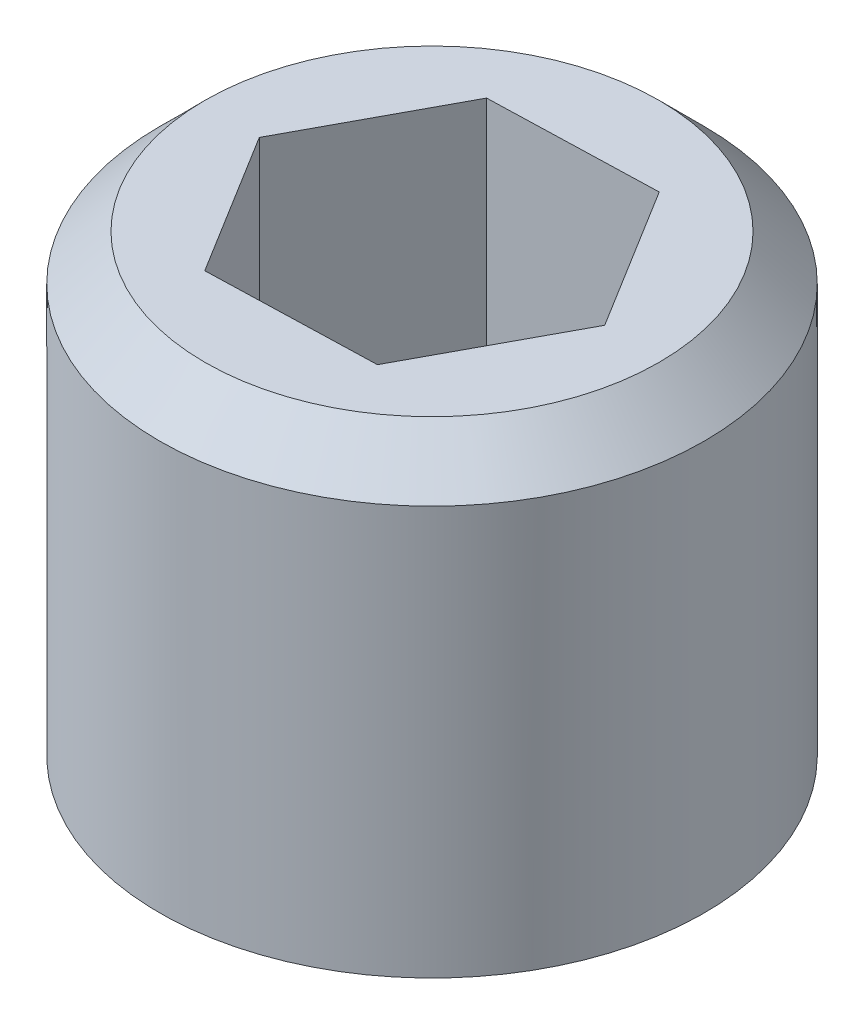
ISO-10303-21;
HEADER;
FILE_DESCRIPTION(('STEP AP214'),'2;1');
FILE_NAME('part.step','',(''),(''),'','','');
FILE_SCHEMA(('AUTOMOTIVE_DESIGN { 1 0 10303 214 1 1 1 1 }'));
ENDSEC;
DATA;
#1=APPLICATION_CONTEXT('core data for automotive mechanical design processes');
#2=APPLICATION_PROTOCOL_DEFINITION('international standard','automotive_design',2000,#1);
#3=PRODUCT_CONTEXT('',#1,'mechanical');
#4=PRODUCT('Part','Part','',(#3));
#5=PRODUCT_RELATED_PRODUCT_CATEGORY('part','',(#4));
#6=PRODUCT_DEFINITION_FORMATION('','',#4);
#7=PRODUCT_DEFINITION_CONTEXT('part definition',#1,'design');
#8=PRODUCT_DEFINITION('design','',#6,#7);
#9=PRODUCT_DEFINITION_SHAPE('','',#8);
#10=(LENGTH_UNIT() NAMED_UNIT(*) SI_UNIT(.MILLI.,.METRE.));
#11=(NAMED_UNIT(*) PLANE_ANGLE_UNIT() SI_UNIT($,.RADIAN.));
#12=(NAMED_UNIT(*) SI_UNIT($,.STERADIAN.) SOLID_ANGLE_UNIT());
#13=UNCERTAINTY_MEASURE_WITH_UNIT(LENGTH_MEASURE(1.E-05),#10,'distance_accuracy_value','');
#14=(GEOMETRIC_REPRESENTATION_CONTEXT(3) GLOBAL_UNCERTAINTY_ASSIGNED_CONTEXT((#13)) GLOBAL_UNIT_ASSIGNED_CONTEXT((#10,
#11,#12)) REPRESENTATION_CONTEXT('',''));
#15=CARTESIAN_POINT('',(0.,0.,0.));
#16=DIRECTION('',(0.,0.,1.));
#17=DIRECTION('',(1.,0.,0.));
#18=AXIS2_PLACEMENT_3D('',#15,#16,#17);
#19=CARTESIAN_POINT('',(-0.125,3.5,0.));
#20=DIRECTION('',(0.,1.,0.));
#21=DIRECTION('',(0.,0.,-1.));
#22=AXIS2_PLACEMENT_3D('',#19,#20,#21);
#23=PLANE('',#22);
#24=DIRECTION('',(0.473942369787866,0.,-0.880555864281115));
#25=VECTOR('',#24,1.);
#26=CARTESIAN_POINT('',(4.28554008760297,3.5,0.785865228053737));
#27=LINE('',#26,#25);
#28=CARTESIAN_POINT('',(4.28554008760297,3.5,0.785865228053737));
#29=VERTEX_POINT('',#28);
#30=CARTESIAN_POINT('',(4.72334929524681,3.5,-0.0275574363929924));
#31=VERTEX_POINT('',#30);
#32=EDGE_CURVE('E117',#29,#31,#27,.T.);
#33=ORIENTED_EDGE('',*,*,#32,.T.);
#34=DIRECTION('',(-0.525612563024875,0.,-0.850724064306648));
#35=VECTOR('',#34,1.);
#36=CARTESIAN_POINT('',(4.72334929524681,3.5,-0.0275574363929924));
#37=LINE('',#36,#35);
#38=CARTESIAN_POINT('',(4.23780920764383,3.5,-0.81342266444665));
#39=VERTEX_POINT('',#38);
#40=EDGE_CURVE('E115',#31,#39,#37,.T.);
#41=ORIENTED_EDGE('',*,*,#40,.T.);
#42=DIRECTION('',(-0.999554932812741,0.,0.0298317999744676));
#43=VECTOR('',#42,1.);
#44=CARTESIAN_POINT('',(4.23780920764383,3.5,-0.81342266444665));
#45=LINE('',#44,#43);
#46=CARTESIAN_POINT('',(3.31445991239702,3.5,-0.785865228053578));
#47=VERTEX_POINT('',#46);
#48=EDGE_CURVE('E102',#39,#47,#45,.T.);
#49=ORIENTED_EDGE('',*,*,#48,.T.);
#50=DIRECTION('',(-0.473942369787866,0.,0.880555864281115));
#51=VECTOR('',#50,1.);
#52=CARTESIAN_POINT('',(3.31445991239702,3.5,-0.785865228053578));
#53=LINE('',#52,#51);
#54=CARTESIAN_POINT('',(2.87665070475319,3.5,0.0275574363931507));
#55=VERTEX_POINT('',#54);
#56=EDGE_CURVE('E158',#47,#55,#53,.T.);
#57=ORIENTED_EDGE('',*,*,#56,.T.);
#58=DIRECTION('',(0.525612563024875,0.,0.850724064306648));
#59=VECTOR('',#58,1.);
#60=CARTESIAN_POINT('',(2.87665070475319,3.5,0.0275574363931507));
#61=LINE('',#60,#59);
#62=CARTESIAN_POINT('',(3.36219079235617,3.5,0.813422664446808));
#63=VERTEX_POINT('',#62);
#64=EDGE_CURVE('E20',#55,#63,#61,.T.);
#65=ORIENTED_EDGE('',*,*,#64,.T.);
#66=DIRECTION('',(0.999554932812741,0.,-0.0298317999744676));
#67=VECTOR('',#66,1.);
#68=CARTESIAN_POINT('',(3.36219079235617,3.5,0.813422664446808));
#69=LINE('',#68,#67);
#70=EDGE_CURVE('E11',#63,#29,#69,.T.);
#71=ORIENTED_EDGE('',*,*,#70,.T.);
#72=EDGE_LOOP('',(#33,#41,#49,#57,#65,#71));
#73=FACE_BOUND('',#72,.T.);
#74=ADVANCED_FACE('F17',(#73),#23,.T.);
#75=CARTESIAN_POINT('',(3.36219079235617,7.00128218155395,0.813422664446808));
#76=DIRECTION('',(-0.0298317999744677,0.,-0.999554932812741));
#77=DIRECTION('',(-0.999554932812741,0.,0.0298317999744677));
#78=AXIS2_PLACEMENT_3D('',#75,#76,#77);
#79=PLANE('',#78);
#80=DIRECTION('',(0.999554932812741,0.,-0.0298317999744676));
#81=VECTOR('',#80,1.);
#82=CARTESIAN_POINT('',(3.36219079235617,5.,0.813422664446808));
#83=LINE('',#82,#81);
#84=CARTESIAN_POINT('',(3.36219079235617,5.,0.813422664446809));
#85=VERTEX_POINT('',#84);
#86=CARTESIAN_POINT('',(4.28554008760297,5.,0.785865228053737));
#87=VERTEX_POINT('',#86);
#88=EDGE_CURVE('E176',#85,#87,#83,.T.);
#89=ORIENTED_EDGE('',*,*,#88,.T.);
#90=DIRECTION('',(0.,-1.,0.));
#91=VECTOR('',#90,1.);
#92=CARTESIAN_POINT('',(4.28554008760297,6.5,0.785865228053737));
#93=LINE('',#92,#91);
#94=EDGE_CURVE('E127',#87,#29,#93,.T.);
#95=ORIENTED_EDGE('',*,*,#94,.T.);
#96=ORIENTED_EDGE('',*,*,#70,.F.);
#97=DIRECTION('',(0.,-1.,0.));
#98=VECTOR('',#97,1.);
#99=CARTESIAN_POINT('',(3.36219079235617,6.5,0.813422664446808));
#100=LINE('',#99,#98);
#101=EDGE_CURVE('E160',#85,#63,#100,.T.);
#102=ORIENTED_EDGE('',*,*,#101,.F.);
#103=EDGE_LOOP('',(#89,#95,#96,#102));
#104=FACE_BOUND('',#103,.T.);
#105=ADVANCED_FACE('F228',(#104),#79,.T.);
#106=CARTESIAN_POINT('',(2.87665070475319,7.00128218155395,0.0275574363931507));
#107=DIRECTION('',(0.850724064306648,0.,-0.525612563024875));
#108=DIRECTION('',(0.,-1.,0.));
#109=AXIS2_PLACEMENT_3D('',#106,#107,#108);
#110=PLANE('',#109);
#111=DIRECTION('',(0.525612563024876,0.,0.850724064306648));
#112=VECTOR('',#111,1.);
#113=CARTESIAN_POINT('',(2.87665070475319,5.,0.0275574363931507));
#114=LINE('',#113,#112);
#115=CARTESIAN_POINT('',(2.87665070475319,5.,0.0275574363931507));
#116=VERTEX_POINT('',#115);
#117=EDGE_CURVE('E136',#116,#85,#114,.T.);
#118=ORIENTED_EDGE('',*,*,#117,.T.);
#119=ORIENTED_EDGE('',*,*,#101,.T.);
#120=ORIENTED_EDGE('',*,*,#64,.F.);
#121=DIRECTION('',(0.,-1.,0.));
#122=VECTOR('',#121,1.);
#123=CARTESIAN_POINT('',(2.87665070475319,6.5,0.0275574363931507));
#124=LINE('',#123,#122);
#125=EDGE_CURVE('E112',#116,#55,#124,.T.);
#126=ORIENTED_EDGE('',*,*,#125,.F.);
#127=EDGE_LOOP('',(#118,#119,#120,#126));
#128=FACE_BOUND('',#127,.T.);
#129=ADVANCED_FACE('F172',(#128),#110,.T.);
#130=CARTESIAN_POINT('',(3.31445991239702,7.00128218155395,-0.785865228053578));
#131=DIRECTION('',(0.880555864281115,0.,0.473942369787866));
#132=DIRECTION('',(0.,-1.,0.));
#133=AXIS2_PLACEMENT_3D('',#130,#131,#132);
#134=PLANE('',#133);
#135=DIRECTION('',(-0.473942369787866,0.,0.880555864281115));
#136=VECTOR('',#135,1.);
#137=CARTESIAN_POINT('',(3.31445991239702,5.,-0.785865228053578));
#138=LINE('',#137,#136);
#139=CARTESIAN_POINT('',(3.31445991239702,5.,-0.785865228053578));
#140=VERTEX_POINT('',#139);
#141=EDGE_CURVE('E138',#140,#116,#138,.T.);
#142=ORIENTED_EDGE('',*,*,#141,.T.);
#143=ORIENTED_EDGE('',*,*,#125,.T.);
#144=ORIENTED_EDGE('',*,*,#56,.F.);
#145=DIRECTION('',(0.,-1.,0.));
#146=VECTOR('',#145,1.);
#147=CARTESIAN_POINT('',(3.31445991239702,6.5,-0.785865228053578));
#148=LINE('',#147,#146);
#149=EDGE_CURVE('E109',#140,#47,#148,.T.);
#150=ORIENTED_EDGE('',*,*,#149,.F.);
#151=EDGE_LOOP('',(#142,#143,#144,#150));
#152=FACE_BOUND('',#151,.T.);
#153=ADVANCED_FACE('F169',(#152),#134,.T.);
#154=CARTESIAN_POINT('',(4.23780920764383,7.00128218155395,-0.81342266444665));
#155=DIRECTION('',(0.0298317999744676,0.,0.999554932812741));
#156=DIRECTION('',(0.,-1.,0.));
#157=AXIS2_PLACEMENT_3D('',#154,#155,#156);
#158=PLANE('',#157);
#159=DIRECTION('',(-0.999554932812741,0.,0.0298317999744676));
#160=VECTOR('',#159,1.);
#161=CARTESIAN_POINT('',(4.23780920764383,5.,-0.81342266444665));
#162=LINE('',#161,#160);
#163=CARTESIAN_POINT('',(4.23780920764383,5.,-0.81342266444665));
#164=VERTEX_POINT('',#163);
#165=EDGE_CURVE('E142',#164,#140,#162,.T.);
#166=ORIENTED_EDGE('',*,*,#165,.T.);
#167=ORIENTED_EDGE('',*,*,#149,.T.);
#168=ORIENTED_EDGE('',*,*,#48,.F.);
#169=DIRECTION('',(0.,-1.,0.));
#170=VECTOR('',#169,1.);
#171=CARTESIAN_POINT('',(4.23780920764383,6.5,-0.81342266444665));
#172=LINE('',#171,#170);
#173=EDGE_CURVE('E107',#164,#39,#172,.T.);
#174=ORIENTED_EDGE('',*,*,#173,.F.);
#175=EDGE_LOOP('',(#166,#167,#168,#174));
#176=FACE_BOUND('',#175,.T.);
#177=ADVANCED_FACE('F105',(#176),#158,.T.);
#178=CARTESIAN_POINT('',(4.72334929524681,7.00128218155395,-0.0275574363929924));
#179=DIRECTION('',(-0.850724064306648,0.,0.525612563024875));
#180=DIRECTION('',(0.,1.,0.));
#181=AXIS2_PLACEMENT_3D('',#178,#179,#180);
#182=PLANE('',#181);
#183=DIRECTION('',(-0.525612563024875,0.,-0.850724064306648));
#184=VECTOR('',#183,1.);
#185=CARTESIAN_POINT('',(4.72334929524681,5.,-0.0275574363929924));
#186=LINE('',#185,#184);
#187=CARTESIAN_POINT('',(4.72334929524681,5.,-0.0275574363929924));
#188=VERTEX_POINT('',#187);
#189=EDGE_CURVE('E125',#188,#164,#186,.T.);
#190=ORIENTED_EDGE('',*,*,#189,.T.);
#191=ORIENTED_EDGE('',*,*,#173,.T.);
#192=ORIENTED_EDGE('',*,*,#40,.F.);
#193=DIRECTION('',(0.,-1.,0.));
#194=VECTOR('',#193,1.);
#195=CARTESIAN_POINT('',(4.72334929524681,6.5,-0.0275574363929924));
#196=LINE('',#195,#194);
#197=EDGE_CURVE('E150',#188,#31,#196,.T.);
#198=ORIENTED_EDGE('',*,*,#197,.F.);
#199=EDGE_LOOP('',(#190,#191,#192,#198));
#200=FACE_BOUND('',#199,.T.);
#201=ADVANCED_FACE('F123',(#200),#182,.T.);
#202=CARTESIAN_POINT('',(4.28554008760297,7.00128218155395,0.785865228053737));
#203=DIRECTION('',(-0.880555864281115,0.,-0.473942369787866));
#204=DIRECTION('',(-0.473942369787866,0.,0.880555864281115));
#205=AXIS2_PLACEMENT_3D('',#202,#203,#204);
#206=PLANE('',#205);
#207=DIRECTION('',(0.473942369787866,0.,-0.880555864281115));
#208=VECTOR('',#207,1.);
#209=CARTESIAN_POINT('',(4.28554008760297,5.,0.785865228053737));
#210=LINE('',#209,#208);
#211=EDGE_CURVE('E182',#87,#188,#210,.T.);
#212=ORIENTED_EDGE('',*,*,#211,.T.);
#213=ORIENTED_EDGE('',*,*,#197,.T.);
#214=ORIENTED_EDGE('',*,*,#32,.F.);
#215=ORIENTED_EDGE('',*,*,#94,.F.);
#216=EDGE_LOOP('',(#212,#213,#214,#215));
#217=FACE_BOUND('',#216,.T.);
#218=ADVANCED_FACE('F245',(#217),#206,.T.);
#219=CARTESIAN_POINT('',(3.8,2.5,0.));
#220=DIRECTION('',(0.,1.,0.));
#221=DIRECTION('',(0.,0.,-1.));
#222=AXIS2_PLACEMENT_3D('',#219,#220,#221);
#223=PLANE('',#222);
#224=CARTESIAN_POINT('',(3.8,2.5,0.));
#225=DIRECTION('',(0.,1.,0.));
#226=DIRECTION('',(0.,0.,1.));
#227=AXIS2_PLACEMENT_3D('',#224,#225,#226);
#228=CIRCLE('',#227,1.5);
#229=CARTESIAN_POINT('',(3.8,2.5,-1.49999999999992));
#230=VERTEX_POINT('',#229);
#231=EDGE_CURVE('E146',#230,#230,#228,.T.);
#232=ORIENTED_EDGE('',*,*,#231,.F.);
#233=EDGE_LOOP('',(#232));
#234=FACE_BOUND('',#233,.T.);
#235=ADVANCED_FACE('F224',(#234),#223,.F.);
#236=CARTESIAN_POINT('',(3.8,2.5,0.));
#237=DIRECTION('',(0.,1.,0.));
#238=DIRECTION('',(0.,0.,1.));
#239=AXIS2_PLACEMENT_3D('',#236,#237,#238);
#240=CYLINDRICAL_SURFACE('',#239,1.5);
#241=CARTESIAN_POINT('',(3.8,4.75,0.));
#242=DIRECTION('',(0.,1.,0.));
#243=DIRECTION('',(0.,0.,-1.));
#244=AXIS2_PLACEMENT_3D('',#241,#242,#243);
#245=CIRCLE('',#244,1.5);
#246=CARTESIAN_POINT('',(3.8,4.75,1.50000000000008));
#247=VERTEX_POINT('',#246);
#248=CARTESIAN_POINT('',(3.8,4.75,-1.49999999999992));
#249=VERTEX_POINT('',#248);
#250=EDGE_CURVE('E196',#247,#249,#245,.T.);
#251=ORIENTED_EDGE('',*,*,#250,.F.);
#252=CARTESIAN_POINT('',(3.8,4.75,0.));
#253=DIRECTION('',(0.,1.,0.));
#254=DIRECTION('',(0.,0.,-1.));
#255=AXIS2_PLACEMENT_3D('',#252,#253,#254);
#256=CIRCLE('',#255,1.5);
#257=EDGE_CURVE('E193',#249,#247,#256,.T.);
#258=ORIENTED_EDGE('',*,*,#257,.F.);
#259=DIRECTION('',(0.,-1.,0.));
#260=VECTOR('',#259,1.);
#261=CARTESIAN_POINT('',(3.8,2.5,-1.49999999999992));
#262=LINE('',#261,#260);
#263=EDGE_CURVE('E143',#249,#230,#262,.T.);
#264=ORIENTED_EDGE('',*,*,#263,.T.);
#265=ORIENTED_EDGE('',*,*,#231,.T.);
#266=ORIENTED_EDGE('',*,*,#263,.F.);
#267=EDGE_LOOP('',(#251,#258,#264,#265,#266));
#268=FACE_BOUND('',#267,.T.);
#269=ADVANCED_FACE('F215',(#268),#240,.T.);
#270=CARTESIAN_POINT('',(3.8,5.,0.));
#271=DIRECTION('',(0.,1.,0.));
#272=DIRECTION('',(0.,0.,-1.));
#273=AXIS2_PLACEMENT_3D('',#270,#271,#272);
#274=PLANE('',#273);
#275=ORIENTED_EDGE('',*,*,#189,.F.);
#276=ORIENTED_EDGE('',*,*,#211,.F.);
#277=ORIENTED_EDGE('',*,*,#88,.F.);
#278=ORIENTED_EDGE('',*,*,#117,.F.);
#279=ORIENTED_EDGE('',*,*,#141,.F.);
#280=ORIENTED_EDGE('',*,*,#165,.F.);
#281=EDGE_LOOP('',(#275,#276,#277,#278,#279,#280));
#282=FACE_BOUND('',#281,.T.);
#283=CARTESIAN_POINT('',(3.8,5.,0.));
#284=DIRECTION('',(0.,-1.,0.));
#285=DIRECTION('',(0.,0.,-1.));
#286=AXIS2_PLACEMENT_3D('',#283,#284,#285);
#287=CIRCLE('',#286,1.25);
#288=CARTESIAN_POINT('',(3.8,5.,1.25000000000008));
#289=VERTEX_POINT('',#288);
#290=EDGE_CURVE('E206',#289,#289,#287,.T.);
#291=ORIENTED_EDGE('',*,*,#290,.F.);
#292=EDGE_LOOP('',(#291));
#293=FACE_BOUND('',#292,.T.);
#294=ADVANCED_FACE('F179',(#282,#293),#274,.T.);
#295=CARTESIAN_POINT('',(3.8,4.875,0.));
#296=DIRECTION('',(0.,-1.,0.));
#297=DIRECTION('',(0.,0.,-1.));
#298=AXIS2_PLACEMENT_3D('',#295,#296,#297);
#299=CONICAL_SURFACE('',#298,1.375,0.785398163397448);
#300=ORIENTED_EDGE('',*,*,#290,.T.);
#301=DIRECTION('',(0.,-0.707106781186548,0.707106781186547));
#302=VECTOR('',#301,1.);
#303=CARTESIAN_POINT('',(3.8,4.875,1.37500000000008));
#304=LINE('',#303,#302);
#305=EDGE_CURVE('E202',#289,#247,#304,.T.);
#306=ORIENTED_EDGE('',*,*,#305,.T.);
#307=ORIENTED_EDGE('',*,*,#250,.T.);
#308=ORIENTED_EDGE('',*,*,#257,.T.);
#309=ORIENTED_EDGE('',*,*,#305,.F.);
#310=EDGE_LOOP('',(#300,#306,#307,#308,#309));
#311=FACE_BOUND('',#310,.T.);
#312=ADVANCED_FACE('F213',(#311),#299,.T.);
#313=CLOSED_SHELL('',(#74,#105,#129,#153,#177,#201,#218,#235,#269,#294,#312));
#314=MANIFOLD_SOLID_BREP('B1',#313);
#315=ADVANCED_BREP_SHAPE_REPRESENTATION('',(#18,#314),#14);
#316=SHAPE_DEFINITION_REPRESENTATION(#9,#315);
ENDSEC;
END-ISO-10303-21;
